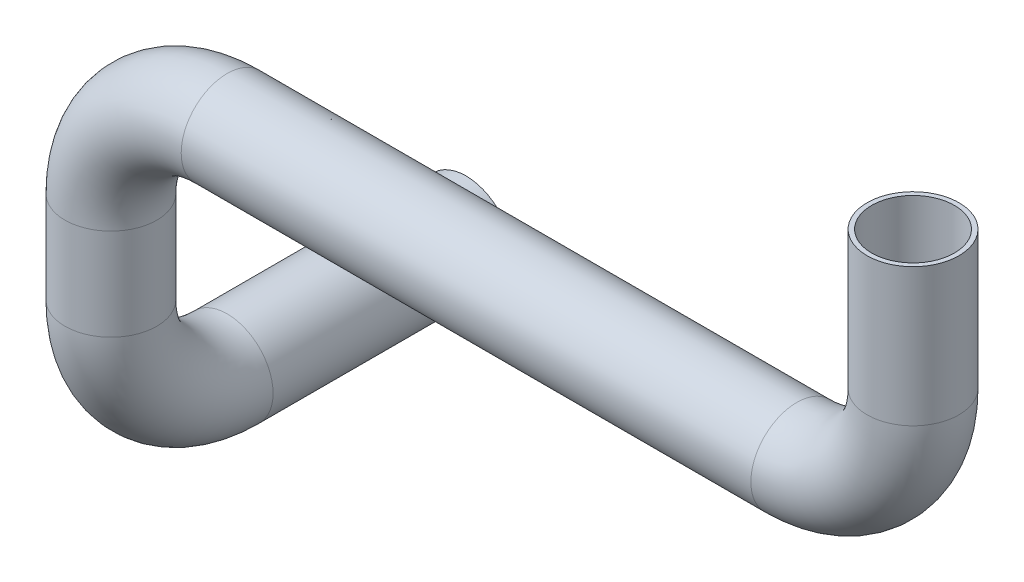
ISO-10303-21;
HEADER;
FILE_DESCRIPTION(('STEP AP214'),'2;1');
FILE_NAME('part.step','',(''),(''),'','','');
FILE_SCHEMA(('AUTOMOTIVE_DESIGN { 1 0 10303 214 1 1 1 1 }'));
ENDSEC;
DATA;
#1=APPLICATION_CONTEXT('core data for automotive mechanical design processes');
#2=APPLICATION_PROTOCOL_DEFINITION('international standard','automotive_design',2000,#1);
#3=PRODUCT_CONTEXT('',#1,'mechanical');
#4=PRODUCT('Part','Part','',(#3));
#5=PRODUCT_RELATED_PRODUCT_CATEGORY('part','',(#4));
#6=PRODUCT_DEFINITION_FORMATION('','',#4);
#7=PRODUCT_DEFINITION_CONTEXT('part definition',#1,'design');
#8=PRODUCT_DEFINITION('design','',#6,#7);
#9=PRODUCT_DEFINITION_SHAPE('','',#8);
#10=(LENGTH_UNIT() NAMED_UNIT(*) SI_UNIT(.MILLI.,.METRE.));
#11=(NAMED_UNIT(*) PLANE_ANGLE_UNIT() SI_UNIT($,.RADIAN.));
#12=(NAMED_UNIT(*) SI_UNIT($,.STERADIAN.) SOLID_ANGLE_UNIT());
#13=UNCERTAINTY_MEASURE_WITH_UNIT(LENGTH_MEASURE(1.E-05),#10,'distance_accuracy_value','');
#14=(GEOMETRIC_REPRESENTATION_CONTEXT(3) GLOBAL_UNCERTAINTY_ASSIGNED_CONTEXT((#13)) GLOBAL_UNIT_ASSIGNED_CONTEXT((#10,
#11,#12)) REPRESENTATION_CONTEXT('',''));
#15=CARTESIAN_POINT('',(0.,0.,0.));
#16=DIRECTION('',(0.,0.,1.));
#17=DIRECTION('',(1.,0.,0.));
#18=AXIS2_PLACEMENT_3D('',#15,#16,#17);
#19=CARTESIAN_POINT('',(87.3,50.3,0.));
#20=DIRECTION('',(0.,1.,0.));
#21=DIRECTION('',(0.,0.,1.));
#22=AXIS2_PLACEMENT_3D('',#19,#20,#21);
#23=PLANE('',#22);
#24=CARTESIAN_POINT('',(87.3,50.3,0.));
#25=DIRECTION('',(0.,1.,0.));
#26=DIRECTION('',(0.,0.,1.));
#27=AXIS2_PLACEMENT_3D('',#24,#25,#26);
#28=CIRCLE('',#27,4.5);
#29=CARTESIAN_POINT('',(87.3,50.3,4.5));
#30=VERTEX_POINT('',#29);
#31=EDGE_CURVE('E68',#30,#30,#28,.T.);
#32=ORIENTED_EDGE('',*,*,#31,.F.);
#33=EDGE_LOOP('',(#32));
#34=FACE_BOUND('',#33,.T.);
#35=CARTESIAN_POINT('',(87.3,50.3,0.));
#36=DIRECTION('',(0.,1.,0.));
#37=DIRECTION('',(0.,0.,1.));
#38=AXIS2_PLACEMENT_3D('',#35,#36,#37);
#39=CIRCLE('',#38,5.);
#40=CARTESIAN_POINT('',(87.3,50.3,5.));
#41=VERTEX_POINT('',#40);
#42=EDGE_CURVE('E10',#41,#41,#39,.T.);
#43=ORIENTED_EDGE('',*,*,#42,.T.);
#44=EDGE_LOOP('',(#43));
#45=FACE_BOUND('',#44,.T.);
#46=ADVANCED_FACE('F37',(#34,#45),#23,.T.);
#47=CARTESIAN_POINT('',(0.,0.,0.));
#48=DIRECTION('',(0.,1.,0.));
#49=DIRECTION('',(0.,0.,1.));
#50=AXIS2_PLACEMENT_3D('',#47,#48,#49);
#51=CYLINDRICAL_SURFACE('',#50,5.);
#52=CARTESIAN_POINT('',(0.,10.,0.));
#53=DIRECTION('',(0.,1.,0.));
#54=DIRECTION('',(0.,0.,1.));
#55=AXIS2_PLACEMENT_3D('',#52,#53,#54);
#56=CIRCLE('',#55,5.);
#57=CARTESIAN_POINT('',(-5.,10.,0.));
#58=VERTEX_POINT('',#57);
#59=EDGE_CURVE('E56',#58,#58,#56,.T.);
#60=ORIENTED_EDGE('',*,*,#59,.F.);
#61=EDGE_LOOP('',(#60));
#62=FACE_BOUND('',#61,.T.);
#63=CARTESIAN_POINT('',(0.,0.,0.));
#64=DIRECTION('',(0.,-1.,0.));
#65=DIRECTION('',(0.,0.,-1.));
#66=AXIS2_PLACEMENT_3D('',#63,#64,#65);
#67=CIRCLE('',#66,5.);
#68=CARTESIAN_POINT('',(0.,0.,5.));
#69=VERTEX_POINT('',#68);
#70=EDGE_CURVE('E65',#69,#69,#67,.T.);
#71=ORIENTED_EDGE('',*,*,#70,.F.);
#72=EDGE_LOOP('',(#71));
#73=FACE_BOUND('',#72,.T.);
#74=ADVANCED_FACE('F135',(#62,#73),#51,.T.);
#75=CARTESIAN_POINT('',(12.65,10.,0.));
#76=DIRECTION('',(0.,0.,-1.));
#77=DIRECTION('',(-1.,0.,0.));
#78=AXIS2_PLACEMENT_3D('',#75,#76,#77);
#79=TOROIDAL_SURFACE('',#78,12.65,5.);
#80=CARTESIAN_POINT('',(12.65,22.65,0.));
#81=DIRECTION('',(1.,0.,0.));
#82=DIRECTION('',(0.,0.,1.));
#83=AXIS2_PLACEMENT_3D('',#80,#81,#82);
#84=CIRCLE('',#83,5.);
#85=CARTESIAN_POINT('',(12.65,27.65,0.));
#86=VERTEX_POINT('',#85);
#87=EDGE_CURVE('E51',#86,#86,#84,.T.);
#88=CARTESIAN_POINT('',(12.65,10.,0.));
#89=DIRECTION('',(0.,0.,-1.));
#90=DIRECTION('',(-1.,0.,0.));
#91=AXIS2_PLACEMENT_3D('',#88,#89,#90);
#92=CIRCLE('',#91,17.65);
#93=EDGE_CURVE('',#58,#86,#92,.T.);
#94=ORIENTED_EDGE('',*,*,#59,.T.);
#95=ORIENTED_EDGE('',*,*,#87,.F.);
#96=ORIENTED_EDGE('',*,*,#93,.T.);
#97=ORIENTED_EDGE('',*,*,#93,.F.);
#98=EDGE_LOOP('',(#94,#96,#95,#97));
#99=FACE_BOUND('',#98,.T.);
#100=ADVANCED_FACE('F131',(#99),#79,.T.);
#101=CARTESIAN_POINT('',(12.65,22.65,0.));
#102=DIRECTION('',(1.,0.,0.));
#103=DIRECTION('',(0.,0.,-1.));
#104=AXIS2_PLACEMENT_3D('',#101,#102,#103);
#105=CYLINDRICAL_SURFACE('',#104,5.);
#106=CARTESIAN_POINT('',(74.65,22.65,0.));
#107=DIRECTION('',(1.,0.,0.));
#108=DIRECTION('',(0.,0.,1.));
#109=AXIS2_PLACEMENT_3D('',#106,#107,#108);
#110=CIRCLE('',#109,5.);
#111=CARTESIAN_POINT('',(74.65,17.65,0.));
#112=VERTEX_POINT('',#111);
#113=EDGE_CURVE('E47',#112,#112,#110,.T.);
#114=ORIENTED_EDGE('',*,*,#113,.F.);
#115=EDGE_LOOP('',(#114));
#116=FACE_BOUND('',#115,.T.);
#117=ORIENTED_EDGE('',*,*,#87,.T.);
#118=EDGE_LOOP('',(#117));
#119=FACE_BOUND('',#118,.T.);
#120=ADVANCED_FACE('F125',(#116,#119),#105,.T.);
#121=CARTESIAN_POINT('',(74.65,35.3,0.));
#122=DIRECTION('',(0.,0.,1.));
#123=DIRECTION('',(1.,0.,0.));
#124=AXIS2_PLACEMENT_3D('',#121,#122,#123);
#125=TOROIDAL_SURFACE('',#124,12.65,5.);
#126=CARTESIAN_POINT('',(87.3,35.3,0.));
#127=DIRECTION('',(0.,1.,0.));
#128=DIRECTION('',(0.,0.,1.));
#129=AXIS2_PLACEMENT_3D('',#126,#127,#128);
#130=CIRCLE('',#129,5.);
#131=CARTESIAN_POINT('',(92.3,35.3,0.));
#132=VERTEX_POINT('',#131);
#133=EDGE_CURVE('E43',#132,#132,#130,.T.);
#134=CARTESIAN_POINT('',(74.65,35.3,0.));
#135=DIRECTION('',(0.,0.,1.));
#136=DIRECTION('',(1.,0.,0.));
#137=AXIS2_PLACEMENT_3D('',#134,#135,#136);
#138=CIRCLE('',#137,17.65);
#139=EDGE_CURVE('',#112,#132,#138,.T.);
#140=ORIENTED_EDGE('',*,*,#113,.T.);
#141=ORIENTED_EDGE('',*,*,#133,.F.);
#142=ORIENTED_EDGE('',*,*,#139,.T.);
#143=ORIENTED_EDGE('',*,*,#139,.F.);
#144=EDGE_LOOP('',(#140,#142,#141,#143));
#145=FACE_BOUND('',#144,.T.);
#146=ADVANCED_FACE('F114',(#145),#125,.T.);
#147=CARTESIAN_POINT('',(87.3,35.3,0.));
#148=DIRECTION('',(0.,1.,0.));
#149=DIRECTION('',(0.,0.,1.));
#150=AXIS2_PLACEMENT_3D('',#147,#148,#149);
#151=CYLINDRICAL_SURFACE('',#150,5.);
#152=ORIENTED_EDGE('',*,*,#42,.F.);
#153=EDGE_LOOP('',(#152));
#154=FACE_BOUND('',#153,.T.);
#155=ORIENTED_EDGE('',*,*,#133,.T.);
#156=EDGE_LOOP('',(#155));
#157=FACE_BOUND('',#156,.T.);
#158=ADVANCED_FACE('F111',(#154,#157),#151,.T.);
#159=CARTESIAN_POINT('',(0.,-12.65,-38.65));
#160=DIRECTION('',(0.,0.,-1.));
#161=DIRECTION('',(0.,1.,0.));
#162=AXIS2_PLACEMENT_3D('',#159,#160,#161);
#163=PLANE('',#162);
#164=CARTESIAN_POINT('',(0.,-12.65,-38.65));
#165=DIRECTION('',(0.,0.,-1.));
#166=DIRECTION('',(0.,1.,0.));
#167=AXIS2_PLACEMENT_3D('',#164,#165,#166);
#168=CIRCLE('',#167,4.5);
#169=CARTESIAN_POINT('',(0.,-8.15,-38.65));
#170=VERTEX_POINT('',#169);
#171=EDGE_CURVE('E69',#170,#170,#168,.T.);
#172=ORIENTED_EDGE('',*,*,#171,.F.);
#173=EDGE_LOOP('',(#172));
#174=FACE_BOUND('',#173,.T.);
#175=CARTESIAN_POINT('',(0.,-12.65,-38.65));
#176=DIRECTION('',(0.,0.,-1.));
#177=DIRECTION('',(0.,1.,0.));
#178=AXIS2_PLACEMENT_3D('',#175,#176,#177);
#179=CIRCLE('',#178,5.);
#180=CARTESIAN_POINT('',(0.,-7.65,-38.65));
#181=VERTEX_POINT('',#180);
#182=EDGE_CURVE('E59',#181,#181,#179,.T.);
#183=ORIENTED_EDGE('',*,*,#182,.T.);
#184=EDGE_LOOP('',(#183));
#185=FACE_BOUND('',#184,.T.);
#186=ADVANCED_FACE('F113',(#174,#185),#163,.T.);
#187=CARTESIAN_POINT('',(0.,0.,-12.65));
#188=DIRECTION('',(1.,0.,0.));
#189=DIRECTION('',(0.,0.,-1.));
#190=AXIS2_PLACEMENT_3D('',#187,#188,#189);
#191=TOROIDAL_SURFACE('',#190,12.65,5.);
#192=CARTESIAN_POINT('',(0.,-12.65,-12.65));
#193=DIRECTION('',(0.,0.,-1.));
#194=DIRECTION('',(0.,1.,0.));
#195=AXIS2_PLACEMENT_3D('',#192,#193,#194);
#196=CIRCLE('',#195,5.);
#197=CARTESIAN_POINT('',(0.,-17.65,-12.65));
#198=VERTEX_POINT('',#197);
#199=EDGE_CURVE('E62',#198,#198,#196,.T.);
#200=CARTESIAN_POINT('',(0.,0.,-12.65));
#201=DIRECTION('',(1.,0.,0.));
#202=DIRECTION('',(0.,0.,-1.));
#203=AXIS2_PLACEMENT_3D('',#200,#201,#202);
#204=CIRCLE('',#203,17.65);
#205=EDGE_CURVE('',#69,#198,#204,.T.);
#206=ORIENTED_EDGE('',*,*,#70,.T.);
#207=ORIENTED_EDGE('',*,*,#199,.F.);
#208=ORIENTED_EDGE('',*,*,#205,.T.);
#209=ORIENTED_EDGE('',*,*,#205,.F.);
#210=EDGE_LOOP('',(#206,#208,#207,#209));
#211=FACE_BOUND('',#210,.T.);
#212=ADVANCED_FACE('F121',(#211),#191,.T.);
#213=CARTESIAN_POINT('',(0.,-12.65,-12.65));
#214=DIRECTION('',(0.,0.,-1.));
#215=DIRECTION('',(-1.,0.,0.));
#216=AXIS2_PLACEMENT_3D('',#213,#214,#215);
#217=CYLINDRICAL_SURFACE('',#216,5.);
#218=ORIENTED_EDGE('',*,*,#182,.F.);
#219=EDGE_LOOP('',(#218));
#220=FACE_BOUND('',#219,.T.);
#221=ORIENTED_EDGE('',*,*,#199,.T.);
#222=EDGE_LOOP('',(#221));
#223=FACE_BOUND('',#222,.T.);
#224=ADVANCED_FACE('F108',(#220,#223),#217,.T.);
#225=CARTESIAN_POINT('',(0.,0.,0.));
#226=DIRECTION('',(0.,1.,0.));
#227=DIRECTION('',(0.,0.,1.));
#228=AXIS2_PLACEMENT_3D('',#225,#226,#227);
#229=CYLINDRICAL_SURFACE('',#228,4.5);
#230=CARTESIAN_POINT('',(0.,10.,0.));
#231=DIRECTION('',(0.,-1.,0.));
#232=DIRECTION('',(0.,0.,-1.));
#233=AXIS2_PLACEMENT_3D('',#230,#231,#232);
#234=CIRCLE('',#233,4.5);
#235=CARTESIAN_POINT('',(-4.5,10.,0.));
#236=VERTEX_POINT('',#235);
#237=EDGE_CURVE('E72',#236,#236,#234,.F.);
#238=ORIENTED_EDGE('',*,*,#237,.T.);
#239=EDGE_LOOP('',(#238));
#240=FACE_BOUND('',#239,.T.);
#241=CARTESIAN_POINT('',(0.,0.,0.));
#242=DIRECTION('',(0.,1.,0.));
#243=DIRECTION('',(0.,0.,1.));
#244=AXIS2_PLACEMENT_3D('',#241,#242,#243);
#245=CIRCLE('',#244,4.5);
#246=CARTESIAN_POINT('',(0.,0.,4.5));
#247=VERTEX_POINT('',#246);
#248=EDGE_CURVE('E79',#247,#247,#245,.F.);
#249=ORIENTED_EDGE('',*,*,#248,.T.);
#250=EDGE_LOOP('',(#249));
#251=FACE_BOUND('',#250,.T.);
#252=ADVANCED_FACE('F93',(#240,#251),#229,.F.);
#253=CARTESIAN_POINT('',(12.65,10.,0.));
#254=DIRECTION('',(0.,0.,-1.));
#255=DIRECTION('',(-1.,0.,0.));
#256=AXIS2_PLACEMENT_3D('',#253,#254,#255);
#257=TOROIDAL_SURFACE('',#256,12.65,4.5);
#258=CARTESIAN_POINT('',(12.65,22.65,0.));
#259=DIRECTION('',(1.,0.,0.));
#260=DIRECTION('',(0.,0.,-1.));
#261=AXIS2_PLACEMENT_3D('',#258,#259,#260);
#262=CIRCLE('',#261,4.5);
#263=CARTESIAN_POINT('',(12.65,27.15,0.));
#264=VERTEX_POINT('',#263);
#265=EDGE_CURVE('E85',#264,#264,#262,.T.);
#266=CARTESIAN_POINT('',(12.65,10.,0.));
#267=DIRECTION('',(0.,0.,-1.));
#268=DIRECTION('',(-1.,0.,0.));
#269=AXIS2_PLACEMENT_3D('',#266,#267,#268);
#270=CIRCLE('',#269,17.15);
#271=EDGE_CURVE('',#236,#264,#270,.T.);
#272=ORIENTED_EDGE('',*,*,#237,.F.);
#273=ORIENTED_EDGE('',*,*,#265,.T.);
#274=ORIENTED_EDGE('',*,*,#271,.T.);
#275=ORIENTED_EDGE('',*,*,#271,.F.);
#276=EDGE_LOOP('',(#272,#274,#273,#275));
#277=FACE_BOUND('',#276,.T.);
#278=ADVANCED_FACE('F96',(#277),#257,.F.);
#279=CARTESIAN_POINT('',(12.65,22.65,0.));
#280=DIRECTION('',(1.,0.,0.));
#281=DIRECTION('',(0.,0.,-1.));
#282=AXIS2_PLACEMENT_3D('',#279,#280,#281);
#283=CYLINDRICAL_SURFACE('',#282,4.5);
#284=CARTESIAN_POINT('',(74.65,22.65,0.));
#285=DIRECTION('',(-1.,0.,0.));
#286=DIRECTION('',(0.,-1.,0.));
#287=AXIS2_PLACEMENT_3D('',#284,#285,#286);
#288=CIRCLE('',#287,4.5);
#289=CARTESIAN_POINT('',(74.65,18.15,0.));
#290=VERTEX_POINT('',#289);
#291=EDGE_CURVE('E82',#290,#290,#288,.F.);
#292=ORIENTED_EDGE('',*,*,#291,.T.);
#293=EDGE_LOOP('',(#292));
#294=FACE_BOUND('',#293,.T.);
#295=ORIENTED_EDGE('',*,*,#265,.F.);
#296=EDGE_LOOP('',(#295));
#297=FACE_BOUND('',#296,.T.);
#298=ADVANCED_FACE('F98',(#294,#297),#283,.F.);
#299=CARTESIAN_POINT('',(74.65,35.3,0.));
#300=DIRECTION('',(0.,0.,1.));
#301=DIRECTION('',(1.,0.,0.));
#302=AXIS2_PLACEMENT_3D('',#299,#300,#301);
#303=TOROIDAL_SURFACE('',#302,12.65,4.5);
#304=CARTESIAN_POINT('',(87.3,35.3,0.));
#305=DIRECTION('',(0.,1.,0.));
#306=DIRECTION('',(0.,0.,1.));
#307=AXIS2_PLACEMENT_3D('',#304,#305,#306);
#308=CIRCLE('',#307,4.5);
#309=CARTESIAN_POINT('',(91.8,35.3,0.));
#310=VERTEX_POINT('',#309);
#311=EDGE_CURVE('E76',#310,#310,#308,.T.);
#312=CARTESIAN_POINT('',(74.65,35.3,0.));
#313=DIRECTION('',(0.,0.,1.));
#314=DIRECTION('',(1.,0.,0.));
#315=AXIS2_PLACEMENT_3D('',#312,#313,#314);
#316=CIRCLE('',#315,17.15);
#317=EDGE_CURVE('',#290,#310,#316,.T.);
#318=ORIENTED_EDGE('',*,*,#291,.F.);
#319=ORIENTED_EDGE('',*,*,#311,.T.);
#320=ORIENTED_EDGE('',*,*,#317,.T.);
#321=ORIENTED_EDGE('',*,*,#317,.F.);
#322=EDGE_LOOP('',(#318,#320,#319,#321));
#323=FACE_BOUND('',#322,.T.);
#324=ADVANCED_FACE('F105',(#323),#303,.F.);
#325=CARTESIAN_POINT('',(87.3,35.3,0.));
#326=DIRECTION('',(0.,1.,0.));
#327=DIRECTION('',(0.,0.,1.));
#328=AXIS2_PLACEMENT_3D('',#325,#326,#327);
#329=CYLINDRICAL_SURFACE('',#328,4.5);
#330=ORIENTED_EDGE('',*,*,#31,.T.);
#331=EDGE_LOOP('',(#330));
#332=FACE_BOUND('',#331,.T.);
#333=ORIENTED_EDGE('',*,*,#311,.F.);
#334=EDGE_LOOP('',(#333));
#335=FACE_BOUND('',#334,.T.);
#336=ADVANCED_FACE('F124',(#332,#335),#329,.F.);
#337=CARTESIAN_POINT('',(0.,0.,-12.65));
#338=DIRECTION('',(1.,0.,0.));
#339=DIRECTION('',(0.,0.,-1.));
#340=AXIS2_PLACEMENT_3D('',#337,#338,#339);
#341=TOROIDAL_SURFACE('',#340,12.65,4.5);
#342=CARTESIAN_POINT('',(0.,-12.65,-12.65));
#343=DIRECTION('',(0.,0.,-1.));
#344=DIRECTION('',(-1.,0.,0.));
#345=AXIS2_PLACEMENT_3D('',#342,#343,#344);
#346=CIRCLE('',#345,4.5);
#347=CARTESIAN_POINT('',(0.,-17.15,-12.65));
#348=VERTEX_POINT('',#347);
#349=EDGE_CURVE('E73',#348,#348,#346,.T.);
#350=CARTESIAN_POINT('',(0.,0.,-12.65));
#351=DIRECTION('',(1.,0.,0.));
#352=DIRECTION('',(0.,0.,-1.));
#353=AXIS2_PLACEMENT_3D('',#350,#351,#352);
#354=CIRCLE('',#353,17.15);
#355=EDGE_CURVE('',#247,#348,#354,.T.);
#356=ORIENTED_EDGE('',*,*,#248,.F.);
#357=ORIENTED_EDGE('',*,*,#349,.T.);
#358=ORIENTED_EDGE('',*,*,#355,.T.);
#359=ORIENTED_EDGE('',*,*,#355,.F.);
#360=EDGE_LOOP('',(#356,#358,#357,#359));
#361=FACE_BOUND('',#360,.T.);
#362=ADVANCED_FACE('F147',(#361),#341,.F.);
#363=CARTESIAN_POINT('',(0.,-12.65,-12.65));
#364=DIRECTION('',(0.,0.,-1.));
#365=DIRECTION('',(-1.,0.,0.));
#366=AXIS2_PLACEMENT_3D('',#363,#364,#365);
#367=CYLINDRICAL_SURFACE('',#366,4.5);
#368=ORIENTED_EDGE('',*,*,#171,.T.);
#369=EDGE_LOOP('',(#368));
#370=FACE_BOUND('',#369,.T.);
#371=ORIENTED_EDGE('',*,*,#349,.F.);
#372=EDGE_LOOP('',(#371));
#373=FACE_BOUND('',#372,.T.);
#374=ADVANCED_FACE('F110',(#370,#373),#367,.F.);
#375=CLOSED_SHELL('',(#46,#74,#100,#120,#146,#158,#186,#212,#224,#252,#278,#298,#324,#336,#362,#374));
#376=MANIFOLD_SOLID_BREP('B2',#375);
#377=ADVANCED_BREP_SHAPE_REPRESENTATION('',(#18,#376),#14);
#378=SHAPE_DEFINITION_REPRESENTATION(#9,#377);
ENDSEC;
END-ISO-10303-21;
